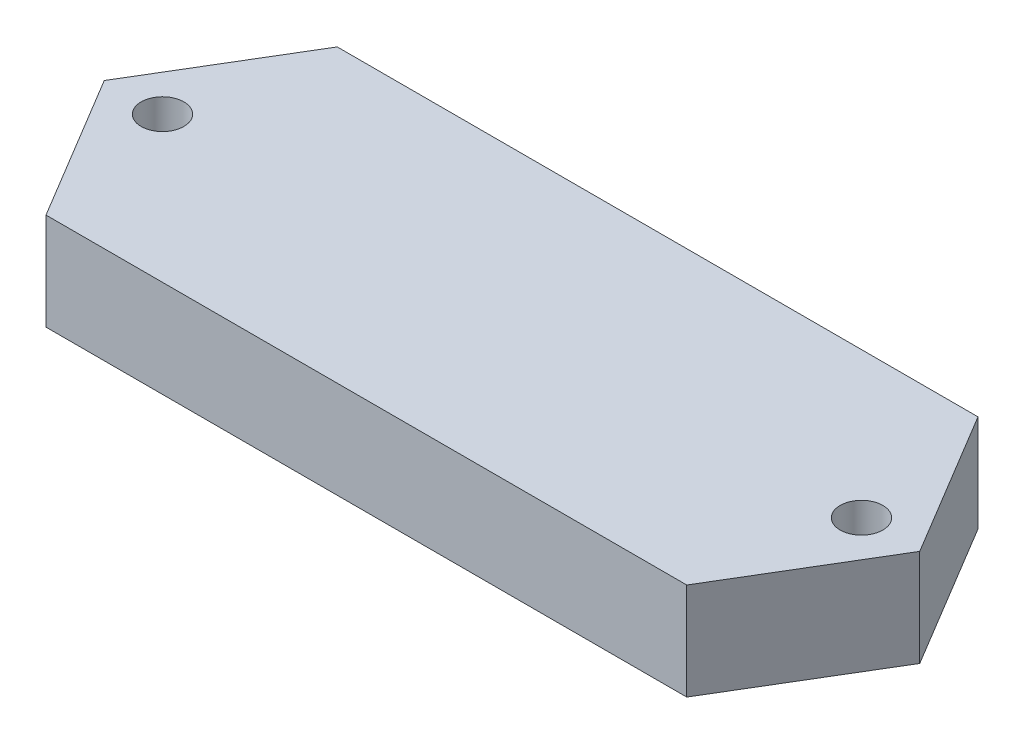
ISO-10303-21;
HEADER;
FILE_DESCRIPTION(('STEP AP214'),'2;1');
FILE_NAME('part.step','',(''),(''),'','','');
FILE_SCHEMA(('AUTOMOTIVE_DESIGN { 1 0 10303 214 1 1 1 1 }'));
ENDSEC;
DATA;
#1=APPLICATION_CONTEXT('core data for automotive mechanical design processes');
#2=APPLICATION_PROTOCOL_DEFINITION('international standard','automotive_design',2000,#1);
#3=PRODUCT_CONTEXT('',#1,'mechanical');
#4=PRODUCT('Part','Part','',(#3));
#5=PRODUCT_RELATED_PRODUCT_CATEGORY('part','',(#4));
#6=PRODUCT_DEFINITION_FORMATION('','',#4);
#7=PRODUCT_DEFINITION_CONTEXT('part definition',#1,'design');
#8=PRODUCT_DEFINITION('design','',#6,#7);
#9=PRODUCT_DEFINITION_SHAPE('','',#8);
#10=(LENGTH_UNIT() NAMED_UNIT(*) SI_UNIT(.MILLI.,.METRE.));
#11=(NAMED_UNIT(*) PLANE_ANGLE_UNIT() SI_UNIT($,.RADIAN.));
#12=(NAMED_UNIT(*) SI_UNIT($,.STERADIAN.) SOLID_ANGLE_UNIT());
#13=UNCERTAINTY_MEASURE_WITH_UNIT(LENGTH_MEASURE(1.E-05),#10,'distance_accuracy_value','');
#14=(GEOMETRIC_REPRESENTATION_CONTEXT(3) GLOBAL_UNCERTAINTY_ASSIGNED_CONTEXT((#13)) GLOBAL_UNIT_ASSIGNED_CONTEXT((#10,
#11,#12)) REPRESENTATION_CONTEXT('',''));
#15=CARTESIAN_POINT('',(0.,0.,0.));
#16=DIRECTION('',(0.,0.,1.));
#17=DIRECTION('',(1.,0.,0.));
#18=AXIS2_PLACEMENT_3D('',#15,#16,#17);
#19=CARTESIAN_POINT('',(0.,5.,-7.5));
#20=DIRECTION('',(0.,0.,1.));
#21=DIRECTION('',(1.,0.,0.));
#22=AXIS2_PLACEMENT_3D('',#19,#20,#21);
#23=PLANE('',#22);
#24=DIRECTION('',(-1.,0.,0.));
#25=VECTOR('',#24,1.);
#26=CARTESIAN_POINT('',(0.,0.,-7.5));
#27=LINE('',#26,#25);
#28=CARTESIAN_POINT('',(16.5,0.,-7.5));
#29=VERTEX_POINT('',#28);
#30=CARTESIAN_POINT('',(-16.5,0.,-7.5));
#31=VERTEX_POINT('',#30);
#32=EDGE_CURVE('E146',#29,#31,#27,.T.);
#33=ORIENTED_EDGE('',*,*,#32,.T.);
#34=DIRECTION('',(0.,-1.,0.));
#35=VECTOR('',#34,1.);
#36=CARTESIAN_POINT('',(-16.5,5.,-7.5));
#37=LINE('',#36,#35);
#38=CARTESIAN_POINT('',(-16.5,5.,-7.5));
#39=VERTEX_POINT('',#38);
#40=EDGE_CURVE('E11',#39,#31,#37,.T.);
#41=ORIENTED_EDGE('',*,*,#40,.F.);
#42=DIRECTION('',(-1.,0.,0.));
#43=VECTOR('',#42,1.);
#44=CARTESIAN_POINT('',(0.,5.,-7.5));
#45=LINE('',#44,#43);
#46=CARTESIAN_POINT('',(16.5,5.,-7.5));
#47=VERTEX_POINT('',#46);
#48=EDGE_CURVE('E97',#47,#39,#45,.T.);
#49=ORIENTED_EDGE('',*,*,#48,.F.);
#50=DIRECTION('',(0.,-1.,0.));
#51=VECTOR('',#50,1.);
#52=CARTESIAN_POINT('',(16.5,5.,-7.5));
#53=LINE('',#52,#51);
#54=EDGE_CURVE('E145',#47,#29,#53,.T.);
#55=ORIENTED_EDGE('',*,*,#54,.T.);
#56=EDGE_LOOP('',(#33,#41,#49,#55));
#57=FACE_BOUND('',#56,.T.);
#58=ADVANCED_FACE('F47',(#57),#23,.F.);
#59=CARTESIAN_POINT('',(-15.4411764705882,5.,-9.26470588235294));
#60=DIRECTION('',(-0.857492925712544,0.,-0.514495755427526));
#61=DIRECTION('',(-0.514495755427526,0.,0.857492925712544));
#62=AXIS2_PLACEMENT_3D('',#59,#60,#61);
#63=PLANE('',#62);
#64=DIRECTION('',(0.514495755427526,0.,-0.857492925712544));
#65=VECTOR('',#64,1.);
#66=CARTESIAN_POINT('',(-15.4411764705882,0.,-9.26470588235294));
#67=LINE('',#66,#65);
#68=CARTESIAN_POINT('',(-21.,0.,0.));
#69=VERTEX_POINT('',#68);
#70=EDGE_CURVE('E150',#69,#31,#67,.T.);
#71=ORIENTED_EDGE('',*,*,#70,.F.);
#72=DIRECTION('',(0.,-1.,0.));
#73=VECTOR('',#72,1.);
#74=CARTESIAN_POINT('',(-21.,5.,0.));
#75=LINE('',#74,#73);
#76=CARTESIAN_POINT('',(-21.,5.,0.));
#77=VERTEX_POINT('',#76);
#78=EDGE_CURVE('E56',#77,#69,#75,.T.);
#79=ORIENTED_EDGE('',*,*,#78,.F.);
#80=DIRECTION('',(0.514495755427526,0.,-0.857492925712544));
#81=VECTOR('',#80,1.);
#82=CARTESIAN_POINT('',(-15.4411764705882,5.,-9.26470588235294));
#83=LINE('',#82,#81);
#84=EDGE_CURVE('E131',#77,#39,#83,.T.);
#85=ORIENTED_EDGE('',*,*,#84,.T.);
#86=ORIENTED_EDGE('',*,*,#40,.T.);
#87=EDGE_LOOP('',(#71,#79,#85,#86));
#88=FACE_BOUND('',#87,.T.);
#89=ADVANCED_FACE('F184',(#88),#63,.T.);
#90=CARTESIAN_POINT('',(-15.4411764705882,5.,9.26470588235294));
#91=DIRECTION('',(-0.857492925712544,0.,0.514495755427527));
#92=DIRECTION('',(0.514495755427527,0.,0.857492925712544));
#93=AXIS2_PLACEMENT_3D('',#90,#91,#92);
#94=PLANE('',#93);
#95=DIRECTION('',(-0.514495755427527,0.,-0.857492925712544));
#96=VECTOR('',#95,1.);
#97=CARTESIAN_POINT('',(-15.4411764705882,0.,9.26470588235294));
#98=LINE('',#97,#96);
#99=CARTESIAN_POINT('',(-16.5,0.,7.5));
#100=VERTEX_POINT('',#99);
#101=EDGE_CURVE('E154',#100,#69,#98,.T.);
#102=ORIENTED_EDGE('',*,*,#101,.F.);
#103=DIRECTION('',(0.,-1.,0.));
#104=VECTOR('',#103,1.);
#105=CARTESIAN_POINT('',(-16.5,5.,7.5));
#106=LINE('',#105,#104);
#107=CARTESIAN_POINT('',(-16.5,5.,7.5));
#108=VERTEX_POINT('',#107);
#109=EDGE_CURVE('E116',#108,#100,#106,.T.);
#110=ORIENTED_EDGE('',*,*,#109,.F.);
#111=DIRECTION('',(-0.514495755427527,0.,-0.857492925712544));
#112=VECTOR('',#111,1.);
#113=CARTESIAN_POINT('',(-15.4411764705882,5.,9.26470588235294));
#114=LINE('',#113,#112);
#115=EDGE_CURVE('E127',#108,#77,#114,.T.);
#116=ORIENTED_EDGE('',*,*,#115,.T.);
#117=ORIENTED_EDGE('',*,*,#78,.T.);
#118=EDGE_LOOP('',(#102,#110,#116,#117));
#119=FACE_BOUND('',#118,.T.);
#120=ADVANCED_FACE('F181',(#119),#94,.T.);
#121=CARTESIAN_POINT('',(0.,5.,7.5));
#122=DIRECTION('',(0.,0.,1.));
#123=DIRECTION('',(1.,0.,0.));
#124=AXIS2_PLACEMENT_3D('',#121,#122,#123);
#125=PLANE('',#124);
#126=DIRECTION('',(-1.,0.,0.));
#127=VECTOR('',#126,1.);
#128=CARTESIAN_POINT('',(0.,0.,7.5));
#129=LINE('',#128,#127);
#130=CARTESIAN_POINT('',(16.5,0.,7.5));
#131=VERTEX_POINT('',#130);
#132=EDGE_CURVE('E114',#131,#100,#129,.T.);
#133=ORIENTED_EDGE('',*,*,#132,.F.);
#134=DIRECTION('',(0.,-1.,0.));
#135=VECTOR('',#134,1.);
#136=CARTESIAN_POINT('',(16.5,5.,7.5));
#137=LINE('',#136,#135);
#138=CARTESIAN_POINT('',(16.5,5.,7.5));
#139=VERTEX_POINT('',#138);
#140=EDGE_CURVE('E108',#139,#131,#137,.T.);
#141=ORIENTED_EDGE('',*,*,#140,.F.);
#142=DIRECTION('',(-1.,0.,0.));
#143=VECTOR('',#142,1.);
#144=CARTESIAN_POINT('',(0.,5.,7.5));
#145=LINE('',#144,#143);
#146=EDGE_CURVE('E112',#139,#108,#145,.T.);
#147=ORIENTED_EDGE('',*,*,#146,.T.);
#148=ORIENTED_EDGE('',*,*,#109,.T.);
#149=EDGE_LOOP('',(#133,#141,#147,#148));
#150=FACE_BOUND('',#149,.T.);
#151=ADVANCED_FACE('F110',(#150),#125,.T.);
#152=CARTESIAN_POINT('',(15.4411764705882,5.,9.26470588235294));
#153=DIRECTION('',(-0.857492925712544,0.,-0.514495755427527));
#154=DIRECTION('',(-0.514495755427527,0.,0.857492925712544));
#155=AXIS2_PLACEMENT_3D('',#152,#153,#154);
#156=PLANE('',#155);
#157=DIRECTION('',(0.514495755427527,0.,-0.857492925712544));
#158=VECTOR('',#157,1.);
#159=CARTESIAN_POINT('',(15.4411764705882,0.,9.26470588235294));
#160=LINE('',#159,#158);
#161=CARTESIAN_POINT('',(21.,0.,0.));
#162=VERTEX_POINT('',#161);
#163=EDGE_CURVE('E85',#131,#162,#160,.T.);
#164=ORIENTED_EDGE('',*,*,#163,.T.);
#165=DIRECTION('',(0.,-1.,0.));
#166=VECTOR('',#165,1.);
#167=CARTESIAN_POINT('',(21.,5.,0.));
#168=LINE('',#167,#166);
#169=CARTESIAN_POINT('',(21.,5.,0.));
#170=VERTEX_POINT('',#169);
#171=EDGE_CURVE('E117',#170,#162,#168,.T.);
#172=ORIENTED_EDGE('',*,*,#171,.F.);
#173=DIRECTION('',(0.514495755427527,0.,-0.857492925712544));
#174=VECTOR('',#173,1.);
#175=CARTESIAN_POINT('',(15.4411764705882,5.,9.26470588235294));
#176=LINE('',#175,#174);
#177=EDGE_CURVE('E119',#139,#170,#176,.T.);
#178=ORIENTED_EDGE('',*,*,#177,.F.);
#179=ORIENTED_EDGE('',*,*,#140,.T.);
#180=EDGE_LOOP('',(#164,#172,#178,#179));
#181=FACE_BOUND('',#180,.T.);
#182=ADVANCED_FACE('F120',(#181),#156,.F.);
#183=CARTESIAN_POINT('',(18.,5.,0.));
#184=DIRECTION('',(0.,-1.,0.));
#185=DIRECTION('',(0.,0.,-1.));
#186=AXIS2_PLACEMENT_3D('',#183,#184,#185);
#187=CYLINDRICAL_SURFACE('',#186,1.1);
#188=CARTESIAN_POINT('',(18.,5.,0.));
#189=DIRECTION('',(0.,1.,0.));
#190=DIRECTION('',(0.,0.,1.));
#191=AXIS2_PLACEMENT_3D('',#188,#189,#190);
#192=CIRCLE('',#191,1.1);
#193=CARTESIAN_POINT('',(18.,5.,1.1));
#194=VERTEX_POINT('',#193);
#195=EDGE_CURVE('E137',#194,#194,#192,.F.);
#196=ORIENTED_EDGE('',*,*,#195,.F.);
#197=EDGE_LOOP('',(#196));
#198=FACE_BOUND('',#197,.T.);
#199=CARTESIAN_POINT('',(18.,0.,0.));
#200=DIRECTION('',(0.,1.,0.));
#201=DIRECTION('',(0.,0.,1.));
#202=AXIS2_PLACEMENT_3D('',#199,#200,#201);
#203=CIRCLE('',#202,1.1);
#204=CARTESIAN_POINT('',(18.,0.,1.1));
#205=VERTEX_POINT('',#204);
#206=EDGE_CURVE('E164',#205,#205,#203,.F.);
#207=ORIENTED_EDGE('',*,*,#206,.T.);
#208=EDGE_LOOP('',(#207));
#209=FACE_BOUND('',#208,.T.);
#210=ADVANCED_FACE('F193',(#198,#209),#187,.F.);
#211=CARTESIAN_POINT('',(15.4411764705882,5.,-9.26470588235294));
#212=DIRECTION('',(-0.857492925712544,0.,0.514495755427526));
#213=DIRECTION('',(0.514495755427526,0.,0.857492925712544));
#214=AXIS2_PLACEMENT_3D('',#211,#212,#213);
#215=PLANE('',#214);
#216=DIRECTION('',(-0.514495755427526,0.,-0.857492925712544));
#217=VECTOR('',#216,1.);
#218=CARTESIAN_POINT('',(15.4411764705882,0.,-9.26470588235294));
#219=LINE('',#218,#217);
#220=EDGE_CURVE('E91',#162,#29,#219,.T.);
#221=ORIENTED_EDGE('',*,*,#220,.T.);
#222=ORIENTED_EDGE('',*,*,#54,.F.);
#223=DIRECTION('',(-0.514495755427526,0.,-0.857492925712544));
#224=VECTOR('',#223,1.);
#225=CARTESIAN_POINT('',(15.4411764705882,5.,-9.26470588235294));
#226=LINE('',#225,#224);
#227=EDGE_CURVE('E64',#170,#47,#226,.T.);
#228=ORIENTED_EDGE('',*,*,#227,.F.);
#229=ORIENTED_EDGE('',*,*,#171,.T.);
#230=EDGE_LOOP('',(#221,#222,#228,#229));
#231=FACE_BOUND('',#230,.T.);
#232=ADVANCED_FACE('F190',(#231),#215,.F.);
#233=CARTESIAN_POINT('',(-18.,5.,0.));
#234=DIRECTION('',(0.,-1.,0.));
#235=DIRECTION('',(0.,0.,-1.));
#236=AXIS2_PLACEMENT_3D('',#233,#234,#235);
#237=CYLINDRICAL_SURFACE('',#236,1.1);
#238=CARTESIAN_POINT('',(-18.,5.,0.));
#239=DIRECTION('',(0.,1.,0.));
#240=DIRECTION('',(0.,0.,1.));
#241=AXIS2_PLACEMENT_3D('',#238,#239,#240);
#242=CIRCLE('',#241,1.1);
#243=CARTESIAN_POINT('',(-18.,5.,1.1));
#244=VERTEX_POINT('',#243);
#245=EDGE_CURVE('E141',#244,#244,#242,.T.);
#246=ORIENTED_EDGE('',*,*,#245,.T.);
#247=EDGE_LOOP('',(#246));
#248=FACE_BOUND('',#247,.T.);
#249=CARTESIAN_POINT('',(-18.,0.,0.));
#250=DIRECTION('',(0.,1.,0.));
#251=DIRECTION('',(0.,0.,1.));
#252=AXIS2_PLACEMENT_3D('',#249,#250,#251);
#253=CIRCLE('',#252,1.1);
#254=CARTESIAN_POINT('',(-18.,0.,1.1));
#255=VERTEX_POINT('',#254);
#256=EDGE_CURVE('E168',#255,#255,#253,.T.);
#257=ORIENTED_EDGE('',*,*,#256,.F.);
#258=EDGE_LOOP('',(#257));
#259=FACE_BOUND('',#258,.T.);
#260=ADVANCED_FACE('F192',(#248,#259),#237,.F.);
#261=CARTESIAN_POINT('',(0.,5.,0.));
#262=DIRECTION('',(0.,1.,0.));
#263=DIRECTION('',(0.,0.,1.));
#264=AXIS2_PLACEMENT_3D('',#261,#262,#263);
#265=PLANE('',#264);
#266=ORIENTED_EDGE('',*,*,#48,.T.);
#267=ORIENTED_EDGE('',*,*,#84,.F.);
#268=ORIENTED_EDGE('',*,*,#115,.F.);
#269=ORIENTED_EDGE('',*,*,#146,.F.);
#270=ORIENTED_EDGE('',*,*,#177,.T.);
#271=ORIENTED_EDGE('',*,*,#227,.T.);
#272=EDGE_LOOP('',(#266,#267,#268,#269,#270,#271));
#273=FACE_BOUND('',#272,.T.);
#274=ORIENTED_EDGE('',*,*,#195,.T.);
#275=EDGE_LOOP('',(#274));
#276=FACE_BOUND('',#275,.T.);
#277=ORIENTED_EDGE('',*,*,#245,.F.);
#278=EDGE_LOOP('',(#277));
#279=FACE_BOUND('',#278,.T.);
#280=ADVANCED_FACE('F124',(#273,#276,#279),#265,.T.);
#281=CARTESIAN_POINT('',(0.,0.,0.));
#282=DIRECTION('',(0.,1.,0.));
#283=DIRECTION('',(0.,0.,1.));
#284=AXIS2_PLACEMENT_3D('',#281,#282,#283);
#285=PLANE('',#284);
#286=ORIENTED_EDGE('',*,*,#32,.F.);
#287=ORIENTED_EDGE('',*,*,#220,.F.);
#288=ORIENTED_EDGE('',*,*,#163,.F.);
#289=ORIENTED_EDGE('',*,*,#132,.T.);
#290=ORIENTED_EDGE('',*,*,#101,.T.);
#291=ORIENTED_EDGE('',*,*,#70,.T.);
#292=EDGE_LOOP('',(#286,#287,#288,#289,#290,#291));
#293=FACE_BOUND('',#292,.T.);
#294=ORIENTED_EDGE('',*,*,#206,.F.);
#295=EDGE_LOOP('',(#294));
#296=FACE_BOUND('',#295,.T.);
#297=ORIENTED_EDGE('',*,*,#256,.T.);
#298=EDGE_LOOP('',(#297));
#299=FACE_BOUND('',#298,.T.);
#300=ADVANCED_FACE('F187',(#293,#296,#299),#285,.F.);
#301=CLOSED_SHELL('',(#58,#89,#120,#151,#182,#210,#232,#260,#280,#300));
#302=MANIFOLD_SOLID_BREP('B2',#301);
#303=ADVANCED_BREP_SHAPE_REPRESENTATION('',(#18,#302),#14);
#304=SHAPE_DEFINITION_REPRESENTATION(#9,#303);
ENDSEC;
END-ISO-10303-21;
